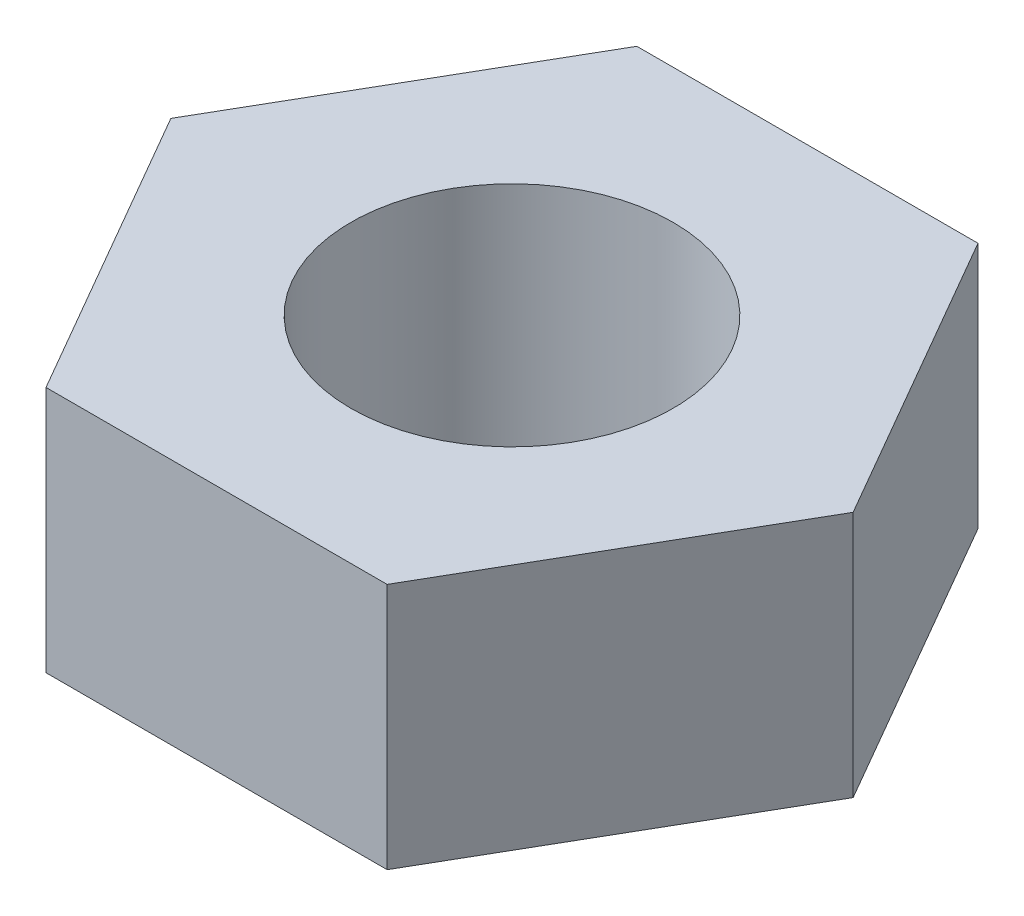
ISO-10303-21;
HEADER;
FILE_DESCRIPTION(('STEP AP214'),'2;1');
FILE_NAME('part.step','',(''),(''),'','','');
FILE_SCHEMA(('AUTOMOTIVE_DESIGN { 1 0 10303 214 1 1 1 1 }'));
ENDSEC;
DATA;
#1=APPLICATION_CONTEXT('core data for automotive mechanical design processes');
#2=APPLICATION_PROTOCOL_DEFINITION('international standard','automotive_design',2000,#1);
#3=PRODUCT_CONTEXT('',#1,'mechanical');
#4=PRODUCT('Part','Part','',(#3));
#5=PRODUCT_RELATED_PRODUCT_CATEGORY('part','',(#4));
#6=PRODUCT_DEFINITION_FORMATION('','',#4);
#7=PRODUCT_DEFINITION_CONTEXT('part definition',#1,'design');
#8=PRODUCT_DEFINITION('design','',#6,#7);
#9=PRODUCT_DEFINITION_SHAPE('','',#8);
#10=(LENGTH_UNIT() NAMED_UNIT(*) SI_UNIT(.MILLI.,.METRE.));
#11=(NAMED_UNIT(*) PLANE_ANGLE_UNIT() SI_UNIT($,.RADIAN.));
#12=(NAMED_UNIT(*) SI_UNIT($,.STERADIAN.) SOLID_ANGLE_UNIT());
#13=UNCERTAINTY_MEASURE_WITH_UNIT(LENGTH_MEASURE(1.E-05),#10,'distance_accuracy_value','');
#14=(GEOMETRIC_REPRESENTATION_CONTEXT(3) GLOBAL_UNCERTAINTY_ASSIGNED_CONTEXT((#13)) GLOBAL_UNIT_ASSIGNED_CONTEXT((#10,
#11,#12)) REPRESENTATION_CONTEXT('',''));
#15=CARTESIAN_POINT('',(0.,0.,0.));
#16=DIRECTION('',(0.,0.,1.));
#17=DIRECTION('',(1.,0.,0.));
#18=AXIS2_PLACEMENT_3D('',#15,#16,#17);
#19=CARTESIAN_POINT('',(0.,2.3,0.));
#20=DIRECTION('',(0.,1.,0.));
#21=DIRECTION('',(0.,0.,1.));
#22=AXIS2_PLACEMENT_3D('',#19,#20,#21);
#23=PLANE('',#22);
#24=DIRECTION('',(0.5,0.,-0.866025403784439));
#25=VECTOR('',#24,1.);
#26=CARTESIAN_POINT('',(1.58771324027147,2.3,2.75000000000001));
#27=LINE('',#26,#25);
#28=CARTESIAN_POINT('',(1.58771324027147,2.3,2.75000000000001));
#29=VERTEX_POINT('',#28);
#30=CARTESIAN_POINT('',(3.17542648054294,2.3,0.));
#31=VERTEX_POINT('',#30);
#32=EDGE_CURVE('E128',#29,#31,#27,.T.);
#33=ORIENTED_EDGE('',*,*,#32,.T.);
#34=DIRECTION('',(-0.500000000000001,0.,-0.866025403784438));
#35=VECTOR('',#34,1.);
#36=CARTESIAN_POINT('',(3.17542648054294,2.3,0.));
#37=LINE('',#36,#35);
#38=CARTESIAN_POINT('',(1.58771324027147,2.3,-2.75000000000001));
#39=VERTEX_POINT('',#38);
#40=EDGE_CURVE('E86',#31,#39,#37,.T.);
#41=ORIENTED_EDGE('',*,*,#40,.T.);
#42=DIRECTION('',(-1.,0.,0.));
#43=VECTOR('',#42,1.);
#44=CARTESIAN_POINT('',(1.58771324027147,2.3,-2.75000000000001));
#45=LINE('',#44,#43);
#46=CARTESIAN_POINT('',(-1.58771324027147,2.3,-2.75000000000001));
#47=VERTEX_POINT('',#46);
#48=EDGE_CURVE('E99',#39,#47,#45,.T.);
#49=ORIENTED_EDGE('',*,*,#48,.T.);
#50=DIRECTION('',(-0.5,0.,0.866025403784439));
#51=VECTOR('',#50,1.);
#52=CARTESIAN_POINT('',(-1.58771324027147,2.3,-2.75000000000001));
#53=LINE('',#52,#51);
#54=CARTESIAN_POINT('',(-3.17542648054295,2.3,0.));
#55=VERTEX_POINT('',#54);
#56=EDGE_CURVE('E93',#47,#55,#53,.T.);
#57=ORIENTED_EDGE('',*,*,#56,.T.);
#58=DIRECTION('',(0.5,0.,0.866025403784439));
#59=VECTOR('',#58,1.);
#60=CARTESIAN_POINT('',(-3.17542648054295,2.3,0.));
#61=LINE('',#60,#59);
#62=CARTESIAN_POINT('',(-1.58771324027148,2.3,2.75000000000001));
#63=VERTEX_POINT('',#62);
#64=EDGE_CURVE('E97',#55,#63,#61,.T.);
#65=ORIENTED_EDGE('',*,*,#64,.T.);
#66=DIRECTION('',(1.,0.,0.));
#67=VECTOR('',#66,1.);
#68=CARTESIAN_POINT('',(-1.58771324027148,2.3,2.75000000000001));
#69=LINE('',#68,#67);
#70=EDGE_CURVE('E49',#63,#29,#69,.T.);
#71=ORIENTED_EDGE('',*,*,#70,.T.);
#72=EDGE_LOOP('',(#33,#41,#49,#57,#65,#71));
#73=FACE_BOUND('',#72,.T.);
#74=CARTESIAN_POINT('',(0.,2.3,0.));
#75=DIRECTION('',(0.,1.,0.));
#76=DIRECTION('',(0.,0.,1.));
#77=AXIS2_PLACEMENT_3D('',#74,#75,#76);
#78=CIRCLE('',#77,1.5);
#79=CARTESIAN_POINT('',(0.,2.3,1.5));
#80=VERTEX_POINT('',#79);
#81=EDGE_CURVE('E121',#80,#80,#78,.T.);
#82=ORIENTED_EDGE('',*,*,#81,.F.);
#83=EDGE_LOOP('',(#82));
#84=FACE_BOUND('',#83,.T.);
#85=ADVANCED_FACE('F32',(#73,#84),#23,.T.);
#86=CARTESIAN_POINT('',(0.,0.,0.));
#87=DIRECTION('',(0.,1.,0.));
#88=DIRECTION('',(0.,0.,1.));
#89=AXIS2_PLACEMENT_3D('',#86,#87,#88);
#90=PLANE('',#89);
#91=DIRECTION('',(0.5,0.,-0.866025403784439));
#92=VECTOR('',#91,1.);
#93=CARTESIAN_POINT('',(1.58771324027147,0.,2.75000000000001));
#94=LINE('',#93,#92);
#95=CARTESIAN_POINT('',(1.58771324027147,0.,2.75000000000001));
#96=VERTEX_POINT('',#95);
#97=CARTESIAN_POINT('',(3.17542648054294,0.,0.));
#98=VERTEX_POINT('',#97);
#99=EDGE_CURVE('E117',#96,#98,#94,.T.);
#100=ORIENTED_EDGE('',*,*,#99,.F.);
#101=DIRECTION('',(1.,0.,0.));
#102=VECTOR('',#101,1.);
#103=CARTESIAN_POINT('',(-1.58771324027148,0.,2.75000000000001));
#104=LINE('',#103,#102);
#105=CARTESIAN_POINT('',(-1.58771324027148,0.,2.75000000000001));
#106=VERTEX_POINT('',#105);
#107=EDGE_CURVE('E78',#106,#96,#104,.T.);
#108=ORIENTED_EDGE('',*,*,#107,.F.);
#109=DIRECTION('',(0.5,0.,0.866025403784439));
#110=VECTOR('',#109,1.);
#111=CARTESIAN_POINT('',(-3.17542648054295,0.,0.));
#112=LINE('',#111,#110);
#113=CARTESIAN_POINT('',(-3.17542648054295,0.,0.));
#114=VERTEX_POINT('',#113);
#115=EDGE_CURVE('E72',#114,#106,#112,.T.);
#116=ORIENTED_EDGE('',*,*,#115,.F.);
#117=DIRECTION('',(-0.5,0.,0.866025403784439));
#118=VECTOR('',#117,1.);
#119=CARTESIAN_POINT('',(-1.58771324027147,0.,-2.75000000000001));
#120=LINE('',#119,#118);
#121=CARTESIAN_POINT('',(-1.58771324027147,0.,-2.75000000000001));
#122=VERTEX_POINT('',#121);
#123=EDGE_CURVE('E107',#122,#114,#120,.T.);
#124=ORIENTED_EDGE('',*,*,#123,.F.);
#125=DIRECTION('',(-1.,0.,0.));
#126=VECTOR('',#125,1.);
#127=CARTESIAN_POINT('',(1.58771324027147,0.,-2.75000000000001));
#128=LINE('',#127,#126);
#129=CARTESIAN_POINT('',(1.58771324027147,0.,-2.75000000000001));
#130=VERTEX_POINT('',#129);
#131=EDGE_CURVE('E123',#130,#122,#128,.T.);
#132=ORIENTED_EDGE('',*,*,#131,.F.);
#133=DIRECTION('',(-0.500000000000001,0.,-0.866025403784438));
#134=VECTOR('',#133,1.);
#135=CARTESIAN_POINT('',(3.17542648054294,0.,0.));
#136=LINE('',#135,#134);
#137=EDGE_CURVE('E120',#98,#130,#136,.T.);
#138=ORIENTED_EDGE('',*,*,#137,.F.);
#139=EDGE_LOOP('',(#100,#108,#116,#124,#132,#138));
#140=FACE_BOUND('',#139,.T.);
#141=CARTESIAN_POINT('',(0.,0.,0.));
#142=DIRECTION('',(0.,1.,0.));
#143=DIRECTION('',(0.,0.,1.));
#144=AXIS2_PLACEMENT_3D('',#141,#142,#143);
#145=CIRCLE('',#144,1.5);
#146=CARTESIAN_POINT('',(0.,0.,1.5));
#147=VERTEX_POINT('',#146);
#148=EDGE_CURVE('E221',#147,#147,#145,.T.);
#149=ORIENTED_EDGE('',*,*,#148,.T.);
#150=EDGE_LOOP('',(#149));
#151=FACE_BOUND('',#150,.T.);
#152=ADVANCED_FACE('F137',(#140,#151),#90,.F.);
#153=CARTESIAN_POINT('',(1.58771324027147,2.3,2.75000000000001));
#154=DIRECTION('',(-0.866025403784439,0.,-0.5));
#155=DIRECTION('',(-0.5,0.,0.866025403784439));
#156=AXIS2_PLACEMENT_3D('',#153,#154,#155);
#157=PLANE('',#156);
#158=ORIENTED_EDGE('',*,*,#99,.T.);
#159=DIRECTION('',(0.,-1.,0.));
#160=VECTOR('',#159,1.);
#161=CARTESIAN_POINT('',(3.17542648054294,2.3,0.));
#162=LINE('',#161,#160);
#163=EDGE_CURVE('E11',#31,#98,#162,.T.);
#164=ORIENTED_EDGE('',*,*,#163,.F.);
#165=ORIENTED_EDGE('',*,*,#32,.F.);
#166=DIRECTION('',(0.,-1.,0.));
#167=VECTOR('',#166,1.);
#168=CARTESIAN_POINT('',(1.58771324027147,2.3,2.75000000000001));
#169=LINE('',#168,#167);
#170=EDGE_CURVE('E113',#29,#96,#169,.T.);
#171=ORIENTED_EDGE('',*,*,#170,.T.);
#172=EDGE_LOOP('',(#158,#164,#165,#171));
#173=FACE_BOUND('',#172,.T.);
#174=ADVANCED_FACE('F34',(#173),#157,.F.);
#175=CARTESIAN_POINT('',(3.17542648054294,2.3,0.));
#176=DIRECTION('',(-0.866025403784438,0.,0.500000000000001));
#177=DIRECTION('',(0.500000000000001,0.,0.866025403784438));
#178=AXIS2_PLACEMENT_3D('',#175,#176,#177);
#179=PLANE('',#178);
#180=ORIENTED_EDGE('',*,*,#137,.T.);
#181=DIRECTION('',(0.,-1.,0.));
#182=VECTOR('',#181,1.);
#183=CARTESIAN_POINT('',(1.58771324027147,2.3,-2.75000000000001));
#184=LINE('',#183,#182);
#185=EDGE_CURVE('E41',#39,#130,#184,.T.);
#186=ORIENTED_EDGE('',*,*,#185,.F.);
#187=ORIENTED_EDGE('',*,*,#40,.F.);
#188=ORIENTED_EDGE('',*,*,#163,.T.);
#189=EDGE_LOOP('',(#180,#186,#187,#188));
#190=FACE_BOUND('',#189,.T.);
#191=ADVANCED_FACE('F162',(#190),#179,.F.);
#192=CARTESIAN_POINT('',(1.58771324027147,2.3,-2.75000000000001));
#193=DIRECTION('',(0.,0.,1.));
#194=DIRECTION('',(1.,0.,0.));
#195=AXIS2_PLACEMENT_3D('',#192,#193,#194);
#196=PLANE('',#195);
#197=ORIENTED_EDGE('',*,*,#131,.T.);
#198=DIRECTION('',(0.,-1.,0.));
#199=VECTOR('',#198,1.);
#200=CARTESIAN_POINT('',(-1.58771324027147,2.3,-2.75000000000001));
#201=LINE('',#200,#199);
#202=EDGE_CURVE('E108',#47,#122,#201,.T.);
#203=ORIENTED_EDGE('',*,*,#202,.F.);
#204=ORIENTED_EDGE('',*,*,#48,.F.);
#205=ORIENTED_EDGE('',*,*,#185,.T.);
#206=EDGE_LOOP('',(#197,#203,#204,#205));
#207=FACE_BOUND('',#206,.T.);
#208=ADVANCED_FACE('F134',(#207),#196,.F.);
#209=CARTESIAN_POINT('',(-1.58771324027147,2.3,-2.75000000000001));
#210=DIRECTION('',(0.866025403784439,0.,0.5));
#211=DIRECTION('',(0.5,0.,-0.866025403784439));
#212=AXIS2_PLACEMENT_3D('',#209,#210,#211);
#213=PLANE('',#212);
#214=ORIENTED_EDGE('',*,*,#123,.T.);
#215=DIRECTION('',(0.,-1.,0.));
#216=VECTOR('',#215,1.);
#217=CARTESIAN_POINT('',(-3.17542648054295,2.3,0.));
#218=LINE('',#217,#216);
#219=EDGE_CURVE('E104',#55,#114,#218,.T.);
#220=ORIENTED_EDGE('',*,*,#219,.F.);
#221=ORIENTED_EDGE('',*,*,#56,.F.);
#222=ORIENTED_EDGE('',*,*,#202,.T.);
#223=EDGE_LOOP('',(#214,#220,#221,#222));
#224=FACE_BOUND('',#223,.T.);
#225=ADVANCED_FACE('F105',(#224),#213,.F.);
#226=CARTESIAN_POINT('',(-3.17542648054295,2.3,0.));
#227=DIRECTION('',(0.866025403784439,0.,-0.5));
#228=DIRECTION('',(-0.5,0.,-0.866025403784439));
#229=AXIS2_PLACEMENT_3D('',#226,#227,#228);
#230=PLANE('',#229);
#231=ORIENTED_EDGE('',*,*,#115,.T.);
#232=DIRECTION('',(0.,-1.,0.));
#233=VECTOR('',#232,1.);
#234=CARTESIAN_POINT('',(-1.58771324027148,2.3,2.75000000000001));
#235=LINE('',#234,#233);
#236=EDGE_CURVE('E109',#63,#106,#235,.T.);
#237=ORIENTED_EDGE('',*,*,#236,.F.);
#238=ORIENTED_EDGE('',*,*,#64,.F.);
#239=ORIENTED_EDGE('',*,*,#219,.T.);
#240=EDGE_LOOP('',(#231,#237,#238,#239));
#241=FACE_BOUND('',#240,.T.);
#242=ADVANCED_FACE('F111',(#241),#230,.F.);
#243=CARTESIAN_POINT('',(-1.58771324027148,2.3,2.75000000000001));
#244=DIRECTION('',(0.,0.,-1.));
#245=DIRECTION('',(-1.,0.,0.));
#246=AXIS2_PLACEMENT_3D('',#243,#244,#245);
#247=PLANE('',#246);
#248=ORIENTED_EDGE('',*,*,#107,.T.);
#249=ORIENTED_EDGE('',*,*,#170,.F.);
#250=ORIENTED_EDGE('',*,*,#70,.F.);
#251=ORIENTED_EDGE('',*,*,#236,.T.);
#252=EDGE_LOOP('',(#248,#249,#250,#251));
#253=FACE_BOUND('',#252,.T.);
#254=ADVANCED_FACE('F142',(#253),#247,.F.);
#255=CARTESIAN_POINT('',(0.,2.3,0.));
#256=DIRECTION('',(0.,-1.,0.));
#257=DIRECTION('',(0.,0.,-1.));
#258=AXIS2_PLACEMENT_3D('',#255,#256,#257);
#259=CYLINDRICAL_SURFACE('',#258,1.5);
#260=ORIENTED_EDGE('',*,*,#81,.T.);
#261=EDGE_LOOP('',(#260));
#262=FACE_BOUND('',#261,.T.);
#263=ORIENTED_EDGE('',*,*,#148,.F.);
#264=EDGE_LOOP('',(#263));
#265=FACE_BOUND('',#264,.T.);
#266=ADVANCED_FACE('F144',(#262,#265),#259,.F.);
#267=CLOSED_SHELL('',(#85,#152,#174,#191,#208,#225,#242,#254,#266));
#268=MANIFOLD_SOLID_BREP('B2',#267);
#269=ADVANCED_BREP_SHAPE_REPRESENTATION('',(#18,#268),#14);
#270=SHAPE_DEFINITION_REPRESENTATION(#9,#269);
ENDSEC;
END-ISO-10303-21;
